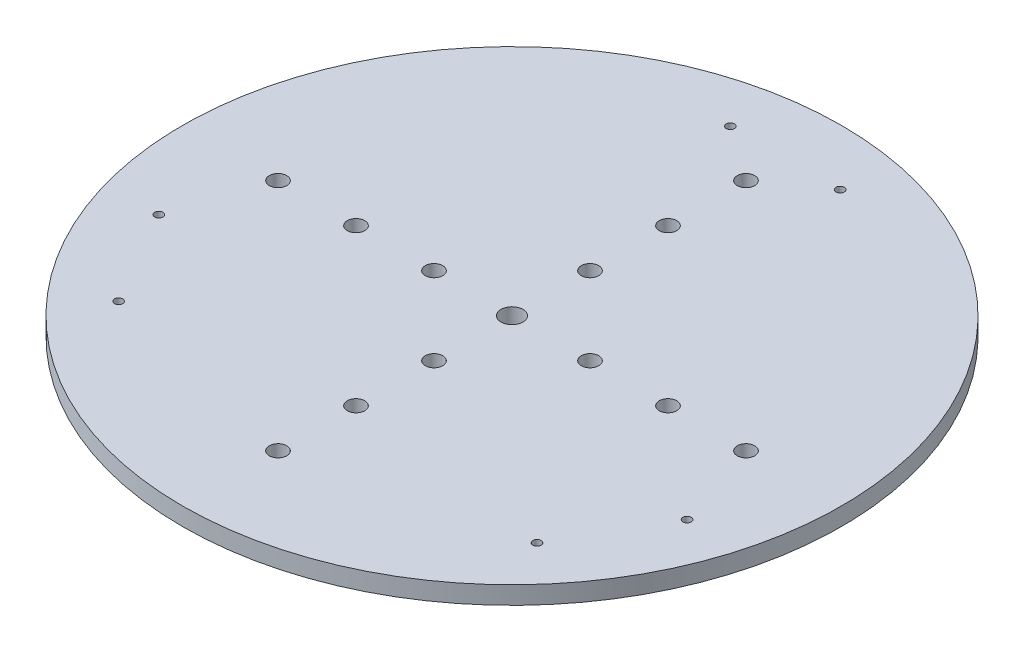
ISO-10303-21;
HEADER;
FILE_DESCRIPTION(('STEP AP214'),'2;1');
FILE_NAME('part.step','',(''),(''),'','','');
FILE_SCHEMA(('AUTOMOTIVE_DESIGN { 1 0 10303 214 1 1 1 1 }'));
ENDSEC;
DATA;
#1=APPLICATION_CONTEXT('core data for automotive mechanical design processes');
#2=APPLICATION_PROTOCOL_DEFINITION('international standard','automotive_design',2000,#1);
#3=PRODUCT_CONTEXT('',#1,'mechanical');
#4=PRODUCT('Part','Part','',(#3));
#5=PRODUCT_RELATED_PRODUCT_CATEGORY('part','',(#4));
#6=PRODUCT_DEFINITION_FORMATION('','',#4);
#7=PRODUCT_DEFINITION_CONTEXT('part definition',#1,'design');
#8=PRODUCT_DEFINITION('design','',#6,#7);
#9=PRODUCT_DEFINITION_SHAPE('','',#8);
#10=(LENGTH_UNIT() NAMED_UNIT(*) SI_UNIT(.MILLI.,.METRE.));
#11=(NAMED_UNIT(*) PLANE_ANGLE_UNIT() SI_UNIT($,.RADIAN.));
#12=(NAMED_UNIT(*) SI_UNIT($,.STERADIAN.) SOLID_ANGLE_UNIT());
#13=UNCERTAINTY_MEASURE_WITH_UNIT(LENGTH_MEASURE(1.E-05),#10,'distance_accuracy_value','');
#14=(GEOMETRIC_REPRESENTATION_CONTEXT(3) GLOBAL_UNCERTAINTY_ASSIGNED_CONTEXT((#13)) GLOBAL_UNIT_ASSIGNED_CONTEXT((#10,
#11,#12)) REPRESENTATION_CONTEXT('',''));
#15=CARTESIAN_POINT('',(0.,0.,0.));
#16=DIRECTION('',(0.,0.,1.));
#17=DIRECTION('',(1.,0.,0.));
#18=AXIS2_PLACEMENT_3D('',#15,#16,#17);
#19=CARTESIAN_POINT('',(0.,6.5,0.));
#20=DIRECTION('',(0.,-1.,0.));
#21=DIRECTION('',(0.,0.,-1.));
#22=AXIS2_PLACEMENT_3D('',#19,#20,#21);
#23=CYLINDRICAL_SURFACE('',#22,120.);
#24=CARTESIAN_POINT('',(0.,6.5,0.));
#25=DIRECTION('',(0.,1.,0.));
#26=DIRECTION('',(0.,0.,1.));
#27=AXIS2_PLACEMENT_3D('',#24,#25,#26);
#28=CIRCLE('',#27,120.);
#29=CARTESIAN_POINT('',(0.,6.5,120.));
#30=VERTEX_POINT('',#29);
#31=EDGE_CURVE('E10',#30,#30,#28,.T.);
#32=ORIENTED_EDGE('',*,*,#31,.F.);
#33=EDGE_LOOP('',(#32));
#34=FACE_BOUND('',#33,.T.);
#35=CARTESIAN_POINT('',(0.,0.,0.));
#36=DIRECTION('',(0.,1.,0.));
#37=DIRECTION('',(0.,0.,1.));
#38=AXIS2_PLACEMENT_3D('',#35,#36,#37);
#39=CIRCLE('',#38,120.);
#40=CARTESIAN_POINT('',(0.,0.,120.));
#41=VERTEX_POINT('',#40);
#42=EDGE_CURVE('E41',#41,#41,#39,.T.);
#43=ORIENTED_EDGE('',*,*,#42,.T.);
#44=EDGE_LOOP('',(#43));
#45=FACE_BOUND('',#44,.T.);
#46=ADVANCED_FACE('F38',(#34,#45),#23,.T.);
#47=CARTESIAN_POINT('',(0.,6.5,0.));
#48=DIRECTION('',(0.,1.,0.));
#49=DIRECTION('',(0.,0.,1.));
#50=AXIS2_PLACEMENT_3D('',#47,#48,#49);
#51=PLANE('',#50);
#52=CARTESIAN_POINT('',(96.1743528028325,6.5,32.4322777122673));
#53=DIRECTION('',(0.,1.,0.));
#54=DIRECTION('',(0.,0.,1.));
#55=AXIS2_PLACEMENT_3D('',#52,#53,#54);
#56=CIRCLE('',#55,1.50000000000001);
#57=CARTESIAN_POINT('',(96.1743528028325,6.5,33.9322777122673));
#58=VERTEX_POINT('',#57);
#59=EDGE_CURVE('E66',#58,#58,#56,.T.);
#60=ORIENTED_EDGE('',*,*,#59,.F.);
#61=EDGE_LOOP('',(#60));
#62=FACE_BOUND('',#61,.T.);
#63=CARTESIAN_POINT('',(76.1743528028328,6.5,67.073293863645));
#64=DIRECTION('',(0.,1.,0.));
#65=DIRECTION('',(0.,0.,1.));
#66=AXIS2_PLACEMENT_3D('',#63,#64,#65);
#67=CIRCLE('',#66,1.50000000000001);
#68=CARTESIAN_POINT('',(76.1743528028328,6.5,68.573293863645));
#69=VERTEX_POINT('',#68);
#70=EDGE_CURVE('E130',#69,#69,#67,.T.);
#71=ORIENTED_EDGE('',*,*,#70,.F.);
#72=EDGE_LOOP('',(#71));
#73=FACE_BOUND('',#72,.T.);
#74=CARTESIAN_POINT('',(-76.1743528028319,6.5,67.0732938636461));
#75=DIRECTION('',(0.,1.,0.));
#76=DIRECTION('',(0.,0.,1.));
#77=AXIS2_PLACEMENT_3D('',#74,#75,#76);
#78=CIRCLE('',#77,1.5);
#79=CARTESIAN_POINT('',(-76.1743528028319,6.5,68.5732938636461));
#80=VERTEX_POINT('',#79);
#81=EDGE_CURVE('E133',#80,#80,#78,.T.);
#82=ORIENTED_EDGE('',*,*,#81,.F.);
#83=EDGE_LOOP('',(#82));
#84=FACE_BOUND('',#83,.T.);
#85=CARTESIAN_POINT('',(-96.174352802832,6.5,32.4322777122686));
#86=DIRECTION('',(0.,1.,0.));
#87=DIRECTION('',(0.,0.,1.));
#88=AXIS2_PLACEMENT_3D('',#85,#86,#87);
#89=CIRCLE('',#88,1.5);
#90=CARTESIAN_POINT('',(-96.174352802832,6.5,33.9322777122686));
#91=VERTEX_POINT('',#90);
#92=EDGE_CURVE('E136',#91,#91,#89,.T.);
#93=ORIENTED_EDGE('',*,*,#92,.F.);
#94=EDGE_LOOP('',(#93));
#95=FACE_BOUND('',#94,.T.);
#96=CARTESIAN_POINT('',(-20.,6.5,-99.5055715759139));
#97=DIRECTION('',(0.,1.,0.));
#98=DIRECTION('',(0.,0.,1.));
#99=AXIS2_PLACEMENT_3D('',#96,#97,#98);
#100=CIRCLE('',#99,1.5);
#101=CARTESIAN_POINT('',(-20.,6.5,-98.0055715759139));
#102=VERTEX_POINT('',#101);
#103=EDGE_CURVE('E139',#102,#102,#100,.T.);
#104=ORIENTED_EDGE('',*,*,#103,.F.);
#105=EDGE_LOOP('',(#104));
#106=FACE_BOUND('',#105,.T.);
#107=CARTESIAN_POINT('',(20.,6.5,-99.5055715759139));
#108=DIRECTION('',(0.,1.,0.));
#109=DIRECTION('',(0.,0.,1.));
#110=AXIS2_PLACEMENT_3D('',#107,#108,#109);
#111=CIRCLE('',#110,1.5);
#112=CARTESIAN_POINT('',(20.,6.5,-98.0055715759139));
#113=VERTEX_POINT('',#112);
#114=EDGE_CURVE('E142',#113,#113,#111,.T.);
#115=ORIENTED_EDGE('',*,*,#114,.F.);
#116=EDGE_LOOP('',(#115));
#117=FACE_BOUND('',#116,.T.);
#118=CARTESIAN_POINT('',(0.,6.5,-28.4));
#119=DIRECTION('',(0.,-1.,0.));
#120=DIRECTION('',(0.,0.,1.));
#121=AXIS2_PLACEMENT_3D('',#118,#119,#120);
#122=CIRCLE('',#121,3.175);
#123=CARTESIAN_POINT('',(0.,6.5,-25.225));
#124=VERTEX_POINT('',#123);
#125=EDGE_CURVE('E65',#124,#124,#122,.T.);
#126=ORIENTED_EDGE('',*,*,#125,.T.);
#127=EDGE_LOOP('',(#126));
#128=FACE_BOUND('',#127,.T.);
#129=CARTESIAN_POINT('',(0.,6.5,-56.8));
#130=DIRECTION('',(0.,-1.,0.));
#131=DIRECTION('',(0.,0.,1.));
#132=AXIS2_PLACEMENT_3D('',#129,#130,#131);
#133=CIRCLE('',#132,3.175);
#134=CARTESIAN_POINT('',(0.,6.5,-53.625));
#135=VERTEX_POINT('',#134);
#136=EDGE_CURVE('E72',#135,#135,#133,.T.);
#137=ORIENTED_EDGE('',*,*,#136,.T.);
#138=EDGE_LOOP('',(#137));
#139=FACE_BOUND('',#138,.T.);
#140=CARTESIAN_POINT('',(0.,6.5,-85.2));
#141=DIRECTION('',(0.,-1.,0.));
#142=DIRECTION('',(0.,0.,1.));
#143=AXIS2_PLACEMENT_3D('',#140,#141,#142);
#144=CIRCLE('',#143,3.175);
#145=CARTESIAN_POINT('',(0.,6.5,-82.025));
#146=VERTEX_POINT('',#145);
#147=EDGE_CURVE('E78',#146,#146,#144,.T.);
#148=ORIENTED_EDGE('',*,*,#147,.T.);
#149=EDGE_LOOP('',(#148));
#150=FACE_BOUND('',#149,.T.);
#151=CARTESIAN_POINT('',(56.8,6.5,0.));
#152=DIRECTION('',(0.,-1.,0.));
#153=DIRECTION('',(0.,0.,-1.));
#154=AXIS2_PLACEMENT_3D('',#151,#152,#153);
#155=CIRCLE('',#154,3.175);
#156=CARTESIAN_POINT('',(56.8,6.5,-3.17499999999998));
#157=VERTEX_POINT('',#156);
#158=EDGE_CURVE('E59',#157,#157,#155,.T.);
#159=ORIENTED_EDGE('',*,*,#158,.T.);
#160=EDGE_LOOP('',(#159));
#161=FACE_BOUND('',#160,.T.);
#162=CARTESIAN_POINT('',(85.2,6.5,0.));
#163=DIRECTION('',(0.,-1.,0.));
#164=DIRECTION('',(0.,0.,-1.));
#165=AXIS2_PLACEMENT_3D('',#162,#163,#164);
#166=CIRCLE('',#165,3.175);
#167=CARTESIAN_POINT('',(85.2,6.5,-3.17499999999997));
#168=VERTEX_POINT('',#167);
#169=EDGE_CURVE('E98',#168,#168,#166,.T.);
#170=ORIENTED_EDGE('',*,*,#169,.T.);
#171=EDGE_LOOP('',(#170));
#172=FACE_BOUND('',#171,.T.);
#173=CARTESIAN_POINT('',(-85.2,6.5,0.));
#174=DIRECTION('',(0.,-1.,0.));
#175=DIRECTION('',(0.,0.,1.));
#176=AXIS2_PLACEMENT_3D('',#173,#174,#175);
#177=CIRCLE('',#176,3.175);
#178=CARTESIAN_POINT('',(-85.2,6.5,3.17500000000002));
#179=VERTEX_POINT('',#178);
#180=EDGE_CURVE('E92',#179,#179,#177,.T.);
#181=ORIENTED_EDGE('',*,*,#180,.T.);
#182=EDGE_LOOP('',(#181));
#183=FACE_BOUND('',#182,.T.);
#184=CARTESIAN_POINT('',(-56.8,6.5,0.));
#185=DIRECTION('',(0.,-1.,0.));
#186=DIRECTION('',(0.,0.,1.));
#187=AXIS2_PLACEMENT_3D('',#184,#185,#186);
#188=CIRCLE('',#187,3.175);
#189=CARTESIAN_POINT('',(-56.8,6.5,3.17500000000002));
#190=VERTEX_POINT('',#189);
#191=EDGE_CURVE('E85',#190,#190,#188,.T.);
#192=ORIENTED_EDGE('',*,*,#191,.T.);
#193=EDGE_LOOP('',(#192));
#194=FACE_BOUND('',#193,.T.);
#195=CARTESIAN_POINT('',(-28.4,6.5,0.));
#196=DIRECTION('',(0.,-1.,0.));
#197=DIRECTION('',(0.,0.,1.));
#198=AXIS2_PLACEMENT_3D('',#195,#196,#197);
#199=CIRCLE('',#198,3.17500000000001);
#200=CARTESIAN_POINT('',(-28.4,6.5,3.17500000000002));
#201=VERTEX_POINT('',#200);
#202=EDGE_CURVE('E86',#201,#201,#199,.T.);
#203=ORIENTED_EDGE('',*,*,#202,.T.);
#204=EDGE_LOOP('',(#203));
#205=FACE_BOUND('',#204,.T.);
#206=CARTESIAN_POINT('',(0.,6.5,28.4));
#207=DIRECTION('',(0.,-1.,0.));
#208=DIRECTION('',(0.,0.,-1.));
#209=AXIS2_PLACEMENT_3D('',#206,#207,#208);
#210=CIRCLE('',#209,3.175);
#211=CARTESIAN_POINT('',(0.,6.5,25.225));
#212=VERTEX_POINT('',#211);
#213=EDGE_CURVE('E120',#212,#212,#210,.T.);
#214=ORIENTED_EDGE('',*,*,#213,.T.);
#215=EDGE_LOOP('',(#214));
#216=FACE_BOUND('',#215,.T.);
#217=CARTESIAN_POINT('',(0.,6.5,56.8));
#218=DIRECTION('',(0.,-1.,0.));
#219=DIRECTION('',(0.,0.,-1.));
#220=AXIS2_PLACEMENT_3D('',#217,#218,#219);
#221=CIRCLE('',#220,3.175);
#222=CARTESIAN_POINT('',(0.,6.5,53.625));
#223=VERTEX_POINT('',#222);
#224=EDGE_CURVE('E114',#223,#223,#221,.T.);
#225=ORIENTED_EDGE('',*,*,#224,.T.);
#226=EDGE_LOOP('',(#225));
#227=FACE_BOUND('',#226,.T.);
#228=CARTESIAN_POINT('',(0.,6.5,85.2));
#229=DIRECTION('',(0.,-1.,0.));
#230=DIRECTION('',(0.,0.,-1.));
#231=AXIS2_PLACEMENT_3D('',#228,#229,#230);
#232=CIRCLE('',#231,3.175);
#233=CARTESIAN_POINT('',(0.,6.5,82.025));
#234=VERTEX_POINT('',#233);
#235=EDGE_CURVE('E108',#234,#234,#232,.T.);
#236=ORIENTED_EDGE('',*,*,#235,.T.);
#237=EDGE_LOOP('',(#236));
#238=FACE_BOUND('',#237,.T.);
#239=CARTESIAN_POINT('',(28.4,6.5,0.));
#240=DIRECTION('',(0.,-1.,0.));
#241=DIRECTION('',(0.,0.,-1.));
#242=AXIS2_PLACEMENT_3D('',#239,#240,#241);
#243=CIRCLE('',#242,3.17500000000001);
#244=CARTESIAN_POINT('',(28.4,6.5,-3.17499999999999));
#245=VERTEX_POINT('',#244);
#246=EDGE_CURVE('E53',#245,#245,#243,.T.);
#247=ORIENTED_EDGE('',*,*,#246,.T.);
#248=EDGE_LOOP('',(#247));
#249=FACE_BOUND('',#248,.T.);
#250=CARTESIAN_POINT('',(0.,6.5,0.));
#251=DIRECTION('',(0.,1.,0.));
#252=DIRECTION('',(0.,0.,1.));
#253=AXIS2_PLACEMENT_3D('',#250,#251,#252);
#254=CIRCLE('',#253,4.);
#255=CARTESIAN_POINT('',(0.,6.5,4.));
#256=VERTEX_POINT('',#255);
#257=EDGE_CURVE('E50',#256,#256,#254,.T.);
#258=ORIENTED_EDGE('',*,*,#257,.F.);
#259=EDGE_LOOP('',(#258));
#260=FACE_BOUND('',#259,.T.);
#261=ORIENTED_EDGE('',*,*,#31,.T.);
#262=EDGE_LOOP('',(#261));
#263=FACE_BOUND('',#262,.T.);
#264=ADVANCED_FACE('F170',(#62,#73,#84,#95,#106,#117,#128,#139,#150,#161,#172,#183,#194,#205,
#216,#227,#238,#249,#260,#263),#51,.T.);
#265=CARTESIAN_POINT('',(0.,0.,0.));
#266=DIRECTION('',(0.,1.,0.));
#267=DIRECTION('',(0.,0.,1.));
#268=AXIS2_PLACEMENT_3D('',#265,#266,#267);
#269=PLANE('',#268);
#270=CARTESIAN_POINT('',(96.1743528028325,0.,32.4322777122673));
#271=DIRECTION('',(0.,-1.,0.));
#272=DIRECTION('',(0.,0.,1.));
#273=AXIS2_PLACEMENT_3D('',#270,#271,#272);
#274=CIRCLE('',#273,1.50000000000001);
#275=CARTESIAN_POINT('',(96.1743528028325,0.,33.9322777122673));
#276=VERTEX_POINT('',#275);
#277=EDGE_CURVE('E149',#276,#276,#274,.T.);
#278=ORIENTED_EDGE('',*,*,#277,.F.);
#279=EDGE_LOOP('',(#278));
#280=FACE_BOUND('',#279,.T.);
#281=CARTESIAN_POINT('',(76.1743528028328,0.,67.073293863645));
#282=DIRECTION('',(0.,-1.,0.));
#283=DIRECTION('',(0.,0.,-1.));
#284=AXIS2_PLACEMENT_3D('',#281,#282,#283);
#285=CIRCLE('',#284,1.50000000000001);
#286=CARTESIAN_POINT('',(76.1743528028328,0.,65.573293863645));
#287=VERTEX_POINT('',#286);
#288=EDGE_CURVE('E152',#287,#287,#285,.T.);
#289=ORIENTED_EDGE('',*,*,#288,.F.);
#290=EDGE_LOOP('',(#289));
#291=FACE_BOUND('',#290,.T.);
#292=CARTESIAN_POINT('',(-76.1743528028319,0.,67.0732938636461));
#293=DIRECTION('',(0.,-1.,0.));
#294=DIRECTION('',(0.,0.,1.));
#295=AXIS2_PLACEMENT_3D('',#292,#293,#294);
#296=CIRCLE('',#295,1.5);
#297=CARTESIAN_POINT('',(-76.1743528028319,0.,68.5732938636461));
#298=VERTEX_POINT('',#297);
#299=EDGE_CURVE('E155',#298,#298,#296,.T.);
#300=ORIENTED_EDGE('',*,*,#299,.F.);
#301=EDGE_LOOP('',(#300));
#302=FACE_BOUND('',#301,.T.);
#303=CARTESIAN_POINT('',(-96.174352802832,0.,32.4322777122686));
#304=DIRECTION('',(0.,-1.,0.));
#305=DIRECTION('',(0.,0.,-1.));
#306=AXIS2_PLACEMENT_3D('',#303,#304,#305);
#307=CIRCLE('',#306,1.5);
#308=CARTESIAN_POINT('',(-96.174352802832,0.,30.9322777122686));
#309=VERTEX_POINT('',#308);
#310=EDGE_CURVE('E158',#309,#309,#307,.T.);
#311=ORIENTED_EDGE('',*,*,#310,.F.);
#312=EDGE_LOOP('',(#311));
#313=FACE_BOUND('',#312,.T.);
#314=CARTESIAN_POINT('',(-20.,0.,-99.5055715759139));
#315=DIRECTION('',(0.,-1.,0.));
#316=DIRECTION('',(0.,0.,1.));
#317=AXIS2_PLACEMENT_3D('',#314,#315,#316);
#318=CIRCLE('',#317,1.5);
#319=CARTESIAN_POINT('',(-20.,0.,-98.0055715759139));
#320=VERTEX_POINT('',#319);
#321=EDGE_CURVE('E148',#320,#320,#318,.T.);
#322=ORIENTED_EDGE('',*,*,#321,.F.);
#323=EDGE_LOOP('',(#322));
#324=FACE_BOUND('',#323,.T.);
#325=CARTESIAN_POINT('',(20.,0.,-99.5055715759139));
#326=DIRECTION('',(0.,-1.,0.));
#327=DIRECTION('',(0.,0.,-1.));
#328=AXIS2_PLACEMENT_3D('',#325,#326,#327);
#329=CIRCLE('',#328,1.5);
#330=CARTESIAN_POINT('',(20.,0.,-101.005571575914));
#331=VERTEX_POINT('',#330);
#332=EDGE_CURVE('E145',#331,#331,#329,.T.);
#333=ORIENTED_EDGE('',*,*,#332,.F.);
#334=EDGE_LOOP('',(#333));
#335=FACE_BOUND('',#334,.T.);
#336=CARTESIAN_POINT('',(0.,0.,-28.4));
#337=DIRECTION('',(0.,-1.,0.));
#338=DIRECTION('',(0.,0.,1.));
#339=AXIS2_PLACEMENT_3D('',#336,#337,#338);
#340=CIRCLE('',#339,3.175);
#341=CARTESIAN_POINT('',(0.,0.,-25.225));
#342=VERTEX_POINT('',#341);
#343=EDGE_CURVE('E62',#342,#342,#340,.T.);
#344=ORIENTED_EDGE('',*,*,#343,.F.);
#345=EDGE_LOOP('',(#344));
#346=FACE_BOUND('',#345,.T.);
#347=CARTESIAN_POINT('',(0.,0.,-56.8));
#348=DIRECTION('',(0.,-1.,0.));
#349=DIRECTION('',(0.,0.,1.));
#350=AXIS2_PLACEMENT_3D('',#347,#348,#349);
#351=CIRCLE('',#350,3.175);
#352=CARTESIAN_POINT('',(0.,0.,-53.625));
#353=VERTEX_POINT('',#352);
#354=EDGE_CURVE('E69',#353,#353,#351,.T.);
#355=ORIENTED_EDGE('',*,*,#354,.F.);
#356=EDGE_LOOP('',(#355));
#357=FACE_BOUND('',#356,.T.);
#358=CARTESIAN_POINT('',(0.,0.,-85.2));
#359=DIRECTION('',(0.,-1.,0.));
#360=DIRECTION('',(0.,0.,1.));
#361=AXIS2_PLACEMENT_3D('',#358,#359,#360);
#362=CIRCLE('',#361,3.175);
#363=CARTESIAN_POINT('',(0.,0.,-82.025));
#364=VERTEX_POINT('',#363);
#365=EDGE_CURVE('E75',#364,#364,#362,.T.);
#366=ORIENTED_EDGE('',*,*,#365,.F.);
#367=EDGE_LOOP('',(#366));
#368=FACE_BOUND('',#367,.T.);
#369=CARTESIAN_POINT('',(56.8,0.,0.));
#370=DIRECTION('',(0.,-1.,0.));
#371=DIRECTION('',(0.,0.,-1.));
#372=AXIS2_PLACEMENT_3D('',#369,#370,#371);
#373=CIRCLE('',#372,3.175);
#374=CARTESIAN_POINT('',(56.8,0.,-3.17499999999998));
#375=VERTEX_POINT('',#374);
#376=EDGE_CURVE('E101',#375,#375,#373,.T.);
#377=ORIENTED_EDGE('',*,*,#376,.F.);
#378=EDGE_LOOP('',(#377));
#379=FACE_BOUND('',#378,.T.);
#380=CARTESIAN_POINT('',(85.2,0.,0.));
#381=DIRECTION('',(0.,-1.,0.));
#382=DIRECTION('',(0.,0.,-1.));
#383=AXIS2_PLACEMENT_3D('',#380,#381,#382);
#384=CIRCLE('',#383,3.175);
#385=CARTESIAN_POINT('',(85.2,0.,-3.17499999999997));
#386=VERTEX_POINT('',#385);
#387=EDGE_CURVE('E95',#386,#386,#384,.T.);
#388=ORIENTED_EDGE('',*,*,#387,.F.);
#389=EDGE_LOOP('',(#388));
#390=FACE_BOUND('',#389,.T.);
#391=CARTESIAN_POINT('',(-85.2,0.,0.));
#392=DIRECTION('',(0.,-1.,0.));
#393=DIRECTION('',(0.,0.,1.));
#394=AXIS2_PLACEMENT_3D('',#391,#392,#393);
#395=CIRCLE('',#394,3.175);
#396=CARTESIAN_POINT('',(-85.2,0.,3.17500000000002));
#397=VERTEX_POINT('',#396);
#398=EDGE_CURVE('E89',#397,#397,#395,.T.);
#399=ORIENTED_EDGE('',*,*,#398,.F.);
#400=EDGE_LOOP('',(#399));
#401=FACE_BOUND('',#400,.T.);
#402=CARTESIAN_POINT('',(-56.8,0.,0.));
#403=DIRECTION('',(0.,-1.,0.));
#404=DIRECTION('',(0.,0.,1.));
#405=AXIS2_PLACEMENT_3D('',#402,#403,#404);
#406=CIRCLE('',#405,3.175);
#407=CARTESIAN_POINT('',(-56.8,0.,3.17500000000002));
#408=VERTEX_POINT('',#407);
#409=EDGE_CURVE('E82',#408,#408,#406,.T.);
#410=ORIENTED_EDGE('',*,*,#409,.F.);
#411=EDGE_LOOP('',(#410));
#412=FACE_BOUND('',#411,.T.);
#413=CARTESIAN_POINT('',(-28.4,0.,0.));
#414=DIRECTION('',(0.,-1.,0.));
#415=DIRECTION('',(0.,0.,1.));
#416=AXIS2_PLACEMENT_3D('',#413,#414,#415);
#417=CIRCLE('',#416,3.17500000000001);
#418=CARTESIAN_POINT('',(-28.4,0.,3.17500000000002));
#419=VERTEX_POINT('',#418);
#420=EDGE_CURVE('E123',#419,#419,#417,.T.);
#421=ORIENTED_EDGE('',*,*,#420,.F.);
#422=EDGE_LOOP('',(#421));
#423=FACE_BOUND('',#422,.T.);
#424=CARTESIAN_POINT('',(0.,0.,28.4));
#425=DIRECTION('',(0.,-1.,0.));
#426=DIRECTION('',(0.,0.,-1.));
#427=AXIS2_PLACEMENT_3D('',#424,#425,#426);
#428=CIRCLE('',#427,3.175);
#429=CARTESIAN_POINT('',(0.,0.,25.225));
#430=VERTEX_POINT('',#429);
#431=EDGE_CURVE('E117',#430,#430,#428,.T.);
#432=ORIENTED_EDGE('',*,*,#431,.F.);
#433=EDGE_LOOP('',(#432));
#434=FACE_BOUND('',#433,.T.);
#435=CARTESIAN_POINT('',(0.,0.,56.8));
#436=DIRECTION('',(0.,-1.,0.));
#437=DIRECTION('',(0.,0.,-1.));
#438=AXIS2_PLACEMENT_3D('',#435,#436,#437);
#439=CIRCLE('',#438,3.175);
#440=CARTESIAN_POINT('',(0.,0.,53.625));
#441=VERTEX_POINT('',#440);
#442=EDGE_CURVE('E111',#441,#441,#439,.T.);
#443=ORIENTED_EDGE('',*,*,#442,.F.);
#444=EDGE_LOOP('',(#443));
#445=FACE_BOUND('',#444,.T.);
#446=CARTESIAN_POINT('',(0.,0.,85.2));
#447=DIRECTION('',(0.,-1.,0.));
#448=DIRECTION('',(0.,0.,-1.));
#449=AXIS2_PLACEMENT_3D('',#446,#447,#448);
#450=CIRCLE('',#449,3.175);
#451=CARTESIAN_POINT('',(0.,0.,82.025));
#452=VERTEX_POINT('',#451);
#453=EDGE_CURVE('E81',#452,#452,#450,.T.);
#454=ORIENTED_EDGE('',*,*,#453,.F.);
#455=EDGE_LOOP('',(#454));
#456=FACE_BOUND('',#455,.T.);
#457=CARTESIAN_POINT('',(28.4,0.,0.));
#458=DIRECTION('',(0.,-1.,0.));
#459=DIRECTION('',(0.,0.,-1.));
#460=AXIS2_PLACEMENT_3D('',#457,#458,#459);
#461=CIRCLE('',#460,3.17500000000001);
#462=CARTESIAN_POINT('',(28.4,0.,-3.17499999999999));
#463=VERTEX_POINT('',#462);
#464=EDGE_CURVE('E56',#463,#463,#461,.T.);
#465=ORIENTED_EDGE('',*,*,#464,.F.);
#466=EDGE_LOOP('',(#465));
#467=FACE_BOUND('',#466,.T.);
#468=CARTESIAN_POINT('',(0.,0.,0.));
#469=DIRECTION('',(0.,1.,0.));
#470=DIRECTION('',(0.,0.,1.));
#471=AXIS2_PLACEMENT_3D('',#468,#469,#470);
#472=CIRCLE('',#471,4.);
#473=CARTESIAN_POINT('',(0.,0.,4.));
#474=VERTEX_POINT('',#473);
#475=EDGE_CURVE('E48',#474,#474,#472,.T.);
#476=ORIENTED_EDGE('',*,*,#475,.T.);
#477=EDGE_LOOP('',(#476));
#478=FACE_BOUND('',#477,.T.);
#479=ORIENTED_EDGE('',*,*,#42,.F.);
#480=EDGE_LOOP('',(#479));
#481=FACE_BOUND('',#480,.T.);
#482=ADVANCED_FACE('F166',(#280,#291,#302,#313,#324,#335,#346,#357,#368,#379,#390,#401,#412,
#423,#434,#445,#456,#467,#478,#481),#269,.F.);
#483=CARTESIAN_POINT('',(0.,0.,0.));
#484=DIRECTION('',(0.,1.,0.));
#485=DIRECTION('',(0.,0.,1.));
#486=AXIS2_PLACEMENT_3D('',#483,#484,#485);
#487=CYLINDRICAL_SURFACE('',#486,4.);
#488=ORIENTED_EDGE('',*,*,#475,.F.);
#489=EDGE_LOOP('',(#488));
#490=FACE_BOUND('',#489,.T.);
#491=ORIENTED_EDGE('',*,*,#257,.T.);
#492=EDGE_LOOP('',(#491));
#493=FACE_BOUND('',#492,.T.);
#494=ADVANCED_FACE('F169',(#490,#493),#487,.F.);
#495=CARTESIAN_POINT('',(28.4,6.5,0.));
#496=DIRECTION('',(0.,-1.,0.));
#497=DIRECTION('',(0.,0.,-1.));
#498=AXIS2_PLACEMENT_3D('',#495,#496,#497);
#499=CYLINDRICAL_SURFACE('',#498,3.17500000000001);
#500=ORIENTED_EDGE('',*,*,#246,.F.);
#501=EDGE_LOOP('',(#500));
#502=FACE_BOUND('',#501,.T.);
#503=ORIENTED_EDGE('',*,*,#464,.T.);
#504=EDGE_LOOP('',(#503));
#505=FACE_BOUND('',#504,.T.);
#506=ADVANCED_FACE('F216',(#502,#505),#499,.F.);
#507=CARTESIAN_POINT('',(0.,6.5,85.2));
#508=DIRECTION('',(0.,-1.,0.));
#509=DIRECTION('',(0.,0.,-1.));
#510=AXIS2_PLACEMENT_3D('',#507,#508,#509);
#511=CYLINDRICAL_SURFACE('',#510,3.175);
#512=ORIENTED_EDGE('',*,*,#235,.F.);
#513=EDGE_LOOP('',(#512));
#514=FACE_BOUND('',#513,.T.);
#515=ORIENTED_EDGE('',*,*,#453,.T.);
#516=EDGE_LOOP('',(#515));
#517=FACE_BOUND('',#516,.T.);
#518=ADVANCED_FACE('F220',(#514,#517),#511,.F.);
#519=CARTESIAN_POINT('',(0.,6.5,56.8));
#520=DIRECTION('',(0.,-1.,0.));
#521=DIRECTION('',(0.,0.,-1.));
#522=AXIS2_PLACEMENT_3D('',#519,#520,#521);
#523=CYLINDRICAL_SURFACE('',#522,3.175);
#524=ORIENTED_EDGE('',*,*,#224,.F.);
#525=EDGE_LOOP('',(#524));
#526=FACE_BOUND('',#525,.T.);
#527=ORIENTED_EDGE('',*,*,#442,.T.);
#528=EDGE_LOOP('',(#527));
#529=FACE_BOUND('',#528,.T.);
#530=ADVANCED_FACE('F254',(#526,#529),#523,.F.);
#531=CARTESIAN_POINT('',(0.,6.5,28.4));
#532=DIRECTION('',(0.,-1.,0.));
#533=DIRECTION('',(0.,0.,-1.));
#534=AXIS2_PLACEMENT_3D('',#531,#532,#533);
#535=CYLINDRICAL_SURFACE('',#534,3.175);
#536=ORIENTED_EDGE('',*,*,#213,.F.);
#537=EDGE_LOOP('',(#536));
#538=FACE_BOUND('',#537,.T.);
#539=ORIENTED_EDGE('',*,*,#431,.T.);
#540=EDGE_LOOP('',(#539));
#541=FACE_BOUND('',#540,.T.);
#542=ADVANCED_FACE('F258',(#538,#541),#535,.F.);
#543=CARTESIAN_POINT('',(-28.4,6.5,0.));
#544=DIRECTION('',(0.,-1.,0.));
#545=DIRECTION('',(0.,0.,-1.));
#546=AXIS2_PLACEMENT_3D('',#543,#544,#545);
#547=CYLINDRICAL_SURFACE('',#546,3.17500000000001);
#548=ORIENTED_EDGE('',*,*,#202,.F.);
#549=EDGE_LOOP('',(#548));
#550=FACE_BOUND('',#549,.T.);
#551=ORIENTED_EDGE('',*,*,#420,.T.);
#552=EDGE_LOOP('',(#551));
#553=FACE_BOUND('',#552,.T.);
#554=ADVANCED_FACE('F240',(#550,#553),#547,.F.);
#555=CARTESIAN_POINT('',(-56.8,6.5,0.));
#556=DIRECTION('',(0.,-1.,0.));
#557=DIRECTION('',(0.,0.,-1.));
#558=AXIS2_PLACEMENT_3D('',#555,#556,#557);
#559=CYLINDRICAL_SURFACE('',#558,3.175);
#560=ORIENTED_EDGE('',*,*,#191,.F.);
#561=EDGE_LOOP('',(#560));
#562=FACE_BOUND('',#561,.T.);
#563=ORIENTED_EDGE('',*,*,#409,.T.);
#564=EDGE_LOOP('',(#563));
#565=FACE_BOUND('',#564,.T.);
#566=ADVANCED_FACE('F236',(#562,#565),#559,.F.);
#567=CARTESIAN_POINT('',(-85.2,6.5,0.));
#568=DIRECTION('',(0.,-1.,0.));
#569=DIRECTION('',(0.,0.,-1.));
#570=AXIS2_PLACEMENT_3D('',#567,#568,#569);
#571=CYLINDRICAL_SURFACE('',#570,3.175);
#572=ORIENTED_EDGE('',*,*,#180,.F.);
#573=EDGE_LOOP('',(#572));
#574=FACE_BOUND('',#573,.T.);
#575=ORIENTED_EDGE('',*,*,#398,.T.);
#576=EDGE_LOOP('',(#575));
#577=FACE_BOUND('',#576,.T.);
#578=ADVANCED_FACE('F239',(#574,#577),#571,.F.);
#579=CARTESIAN_POINT('',(85.2,6.5,0.));
#580=DIRECTION('',(0.,-1.,0.));
#581=DIRECTION('',(0.,0.,-1.));
#582=AXIS2_PLACEMENT_3D('',#579,#580,#581);
#583=CYLINDRICAL_SURFACE('',#582,3.175);
#584=ORIENTED_EDGE('',*,*,#169,.F.);
#585=EDGE_LOOP('',(#584));
#586=FACE_BOUND('',#585,.T.);
#587=ORIENTED_EDGE('',*,*,#387,.T.);
#588=EDGE_LOOP('',(#587));
#589=FACE_BOUND('',#588,.T.);
#590=ADVANCED_FACE('F244',(#586,#589),#583,.F.);
#591=CARTESIAN_POINT('',(56.8,6.5,0.));
#592=DIRECTION('',(0.,-1.,0.));
#593=DIRECTION('',(0.,0.,-1.));
#594=AXIS2_PLACEMENT_3D('',#591,#592,#593);
#595=CYLINDRICAL_SURFACE('',#594,3.175);
#596=ORIENTED_EDGE('',*,*,#158,.F.);
#597=EDGE_LOOP('',(#596));
#598=FACE_BOUND('',#597,.T.);
#599=ORIENTED_EDGE('',*,*,#376,.T.);
#600=EDGE_LOOP('',(#599));
#601=FACE_BOUND('',#600,.T.);
#602=ADVANCED_FACE('F234',(#598,#601),#595,.F.);
#603=CARTESIAN_POINT('',(0.,6.5,-85.2));
#604=DIRECTION('',(0.,-1.,0.));
#605=DIRECTION('',(0.,0.,-1.));
#606=AXIS2_PLACEMENT_3D('',#603,#604,#605);
#607=CYLINDRICAL_SURFACE('',#606,3.175);
#608=ORIENTED_EDGE('',*,*,#147,.F.);
#609=EDGE_LOOP('',(#608));
#610=FACE_BOUND('',#609,.T.);
#611=ORIENTED_EDGE('',*,*,#365,.T.);
#612=EDGE_LOOP('',(#611));
#613=FACE_BOUND('',#612,.T.);
#614=ADVANCED_FACE('F230',(#610,#613),#607,.F.);
#615=CARTESIAN_POINT('',(0.,6.5,-56.8));
#616=DIRECTION('',(0.,-1.,0.));
#617=DIRECTION('',(0.,0.,-1.));
#618=AXIS2_PLACEMENT_3D('',#615,#616,#617);
#619=CYLINDRICAL_SURFACE('',#618,3.175);
#620=ORIENTED_EDGE('',*,*,#136,.F.);
#621=EDGE_LOOP('',(#620));
#622=FACE_BOUND('',#621,.T.);
#623=ORIENTED_EDGE('',*,*,#354,.T.);
#624=EDGE_LOOP('',(#623));
#625=FACE_BOUND('',#624,.T.);
#626=ADVANCED_FACE('F226',(#622,#625),#619,.F.);
#627=CARTESIAN_POINT('',(0.,6.5,-28.4));
#628=DIRECTION('',(0.,-1.,0.));
#629=DIRECTION('',(0.,0.,-1.));
#630=AXIS2_PLACEMENT_3D('',#627,#628,#629);
#631=CYLINDRICAL_SURFACE('',#630,3.175);
#632=ORIENTED_EDGE('',*,*,#125,.F.);
#633=EDGE_LOOP('',(#632));
#634=FACE_BOUND('',#633,.T.);
#635=ORIENTED_EDGE('',*,*,#343,.T.);
#636=EDGE_LOOP('',(#635));
#637=FACE_BOUND('',#636,.T.);
#638=ADVANCED_FACE('F222',(#634,#637),#631,.F.);
#639=CARTESIAN_POINT('',(20.,10.,-99.5055715759139));
#640=DIRECTION('',(0.,-1.,0.));
#641=DIRECTION('',(0.,0.,-1.));
#642=AXIS2_PLACEMENT_3D('',#639,#640,#641);
#643=CYLINDRICAL_SURFACE('',#642,1.5);
#644=ORIENTED_EDGE('',*,*,#114,.T.);
#645=EDGE_LOOP('',(#644));
#646=FACE_BOUND('',#645,.T.);
#647=ORIENTED_EDGE('',*,*,#332,.T.);
#648=EDGE_LOOP('',(#647));
#649=FACE_BOUND('',#648,.T.);
#650=ADVANCED_FACE('F225',(#646,#649),#643,.F.);
#651=CARTESIAN_POINT('',(-20.,10.,-99.5055715759139));
#652=DIRECTION('',(0.,-1.,0.));
#653=DIRECTION('',(0.,0.,-1.));
#654=AXIS2_PLACEMENT_3D('',#651,#652,#653);
#655=CYLINDRICAL_SURFACE('',#654,1.5);
#656=ORIENTED_EDGE('',*,*,#103,.T.);
#657=EDGE_LOOP('',(#656));
#658=FACE_BOUND('',#657,.T.);
#659=ORIENTED_EDGE('',*,*,#321,.T.);
#660=EDGE_LOOP('',(#659));
#661=FACE_BOUND('',#660,.T.);
#662=ADVANCED_FACE('F164',(#658,#661),#655,.F.);
#663=CARTESIAN_POINT('',(-96.174352802832,10.,32.4322777122686));
#664=DIRECTION('',(0.,-1.,0.));
#665=DIRECTION('',(0.,0.,-1.));
#666=AXIS2_PLACEMENT_3D('',#663,#664,#665);
#667=CYLINDRICAL_SURFACE('',#666,1.5);
#668=ORIENTED_EDGE('',*,*,#92,.T.);
#669=EDGE_LOOP('',(#668));
#670=FACE_BOUND('',#669,.T.);
#671=ORIENTED_EDGE('',*,*,#310,.T.);
#672=EDGE_LOOP('',(#671));
#673=FACE_BOUND('',#672,.T.);
#674=ADVANCED_FACE('F280',(#670,#673),#667,.F.);
#675=CARTESIAN_POINT('',(-76.1743528028319,10.,67.0732938636461));
#676=DIRECTION('',(0.,-1.,0.));
#677=DIRECTION('',(0.,0.,-1.));
#678=AXIS2_PLACEMENT_3D('',#675,#676,#677);
#679=CYLINDRICAL_SURFACE('',#678,1.5);
#680=ORIENTED_EDGE('',*,*,#81,.T.);
#681=EDGE_LOOP('',(#680));
#682=FACE_BOUND('',#681,.T.);
#683=ORIENTED_EDGE('',*,*,#299,.T.);
#684=EDGE_LOOP('',(#683));
#685=FACE_BOUND('',#684,.T.);
#686=ADVANCED_FACE('F276',(#682,#685),#679,.F.);
#687=CARTESIAN_POINT('',(76.1743528028328,10.,67.073293863645));
#688=DIRECTION('',(0.,-1.,0.));
#689=DIRECTION('',(0.,0.,-1.));
#690=AXIS2_PLACEMENT_3D('',#687,#688,#689);
#691=CYLINDRICAL_SURFACE('',#690,1.50000000000001);
#692=ORIENTED_EDGE('',*,*,#70,.T.);
#693=EDGE_LOOP('',(#692));
#694=FACE_BOUND('',#693,.T.);
#695=ORIENTED_EDGE('',*,*,#288,.T.);
#696=EDGE_LOOP('',(#695));
#697=FACE_BOUND('',#696,.T.);
#698=ADVANCED_FACE('F272',(#694,#697),#691,.F.);
#699=CARTESIAN_POINT('',(96.1743528028325,10.,32.4322777122673));
#700=DIRECTION('',(0.,-1.,0.));
#701=DIRECTION('',(0.,0.,-1.));
#702=AXIS2_PLACEMENT_3D('',#699,#700,#701);
#703=CYLINDRICAL_SURFACE('',#702,1.50000000000001);
#704=ORIENTED_EDGE('',*,*,#59,.T.);
#705=EDGE_LOOP('',(#704));
#706=FACE_BOUND('',#705,.T.);
#707=ORIENTED_EDGE('',*,*,#277,.T.);
#708=EDGE_LOOP('',(#707));
#709=FACE_BOUND('',#708,.T.);
#710=ADVANCED_FACE('F269',(#706,#709),#703,.F.);
#711=CLOSED_SHELL('',(#46,#264,#482,#494,#506,#518,#530,#542,#554,#566,#578,#590,#602,#614,#626,
#638,#650,#662,#674,#686,#698,#710));
#712=MANIFOLD_SOLID_BREP('B2',#711);
#713=ADVANCED_BREP_SHAPE_REPRESENTATION('',(#18,#712),#14);
#714=SHAPE_DEFINITION_REPRESENTATION(#9,#713);
ENDSEC;
END-ISO-10303-21;
